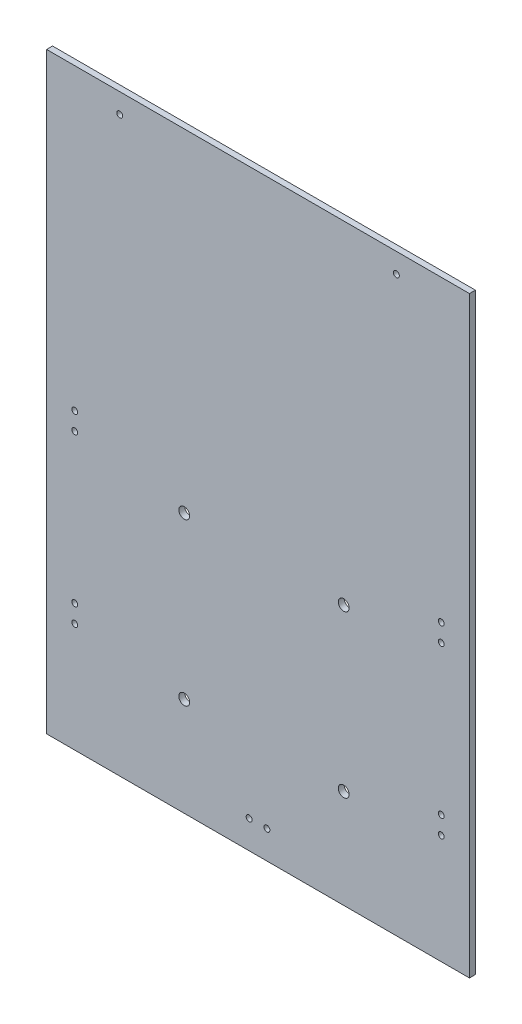
ISO-10303-21;
HEADER;
FILE_DESCRIPTION(('STEP AP214'),'2;1');
FILE_NAME('part.step','',(''),(''),'','','');
FILE_SCHEMA(('AUTOMOTIVE_DESIGN { 1 0 10303 214 1 1 1 1 }'));
ENDSEC;
DATA;
#1=APPLICATION_CONTEXT('core data for automotive mechanical design processes');
#2=APPLICATION_PROTOCOL_DEFINITION('international standard','automotive_design',2000,#1);
#3=PRODUCT_CONTEXT('',#1,'mechanical');
#4=PRODUCT('Part','Part','',(#3));
#5=PRODUCT_RELATED_PRODUCT_CATEGORY('part','',(#4));
#6=PRODUCT_DEFINITION_FORMATION('','',#4);
#7=PRODUCT_DEFINITION_CONTEXT('part definition',#1,'design');
#8=PRODUCT_DEFINITION('design','',#6,#7);
#9=PRODUCT_DEFINITION_SHAPE('','',#8);
#10=(LENGTH_UNIT() NAMED_UNIT(*) SI_UNIT(.MILLI.,.METRE.));
#11=(NAMED_UNIT(*) PLANE_ANGLE_UNIT() SI_UNIT($,.RADIAN.));
#12=(NAMED_UNIT(*) SI_UNIT($,.STERADIAN.) SOLID_ANGLE_UNIT());
#13=UNCERTAINTY_MEASURE_WITH_UNIT(LENGTH_MEASURE(1.E-05),#10,'distance_accuracy_value','');
#14=(GEOMETRIC_REPRESENTATION_CONTEXT(3) GLOBAL_UNCERTAINTY_ASSIGNED_CONTEXT((#13)) GLOBAL_UNIT_ASSIGNED_CONTEXT((#10,
#11,#12)) REPRESENTATION_CONTEXT('',''));
#15=CARTESIAN_POINT('',(0.,0.,0.));
#16=DIRECTION('',(0.,0.,1.));
#17=DIRECTION('',(1.,0.,0.));
#18=AXIS2_PLACEMENT_3D('',#15,#16,#17);
#19=CARTESIAN_POINT('',(0.,0.,3.));
#20=DIRECTION('',(0.,0.,-1.));
#21=DIRECTION('',(-1.,0.,0.));
#22=AXIS2_PLACEMENT_3D('',#19,#20,#21);
#23=PLANE('',#22);
#24=CARTESIAN_POINT('',(-92.7470488231183,-1.25379985810628,3.));
#25=DIRECTION('',(0.,0.,-1.));
#26=DIRECTION('',(-1.,0.,0.));
#27=AXIS2_PLACEMENT_3D('',#24,#25,#26);
#28=CIRCLE('',#27,1.49999999999994);
#29=CARTESIAN_POINT('',(-94.2470488231182,-1.25379985810628,3.));
#30=VERTEX_POINT('',#29);
#31=EDGE_CURVE('E237',#30,#30,#28,.T.);
#32=ORIENTED_EDGE('',*,*,#31,.T.);
#33=EDGE_LOOP('',(#32));
#34=FACE_BOUND('',#33,.T.);
#35=CARTESIAN_POINT('',(-92.7470488231178,-94.6186766336858,3.));
#36=DIRECTION('',(0.,0.,-1.));
#37=DIRECTION('',(-1.,0.,0.));
#38=AXIS2_PLACEMENT_3D('',#35,#36,#37);
#39=CIRCLE('',#38,1.5);
#40=CARTESIAN_POINT('',(-94.2470488231178,-94.6186766336858,3.));
#41=VERTEX_POINT('',#40);
#42=EDGE_CURVE('E241',#41,#41,#39,.T.);
#43=ORIENTED_EDGE('',*,*,#42,.T.);
#44=EDGE_LOOP('',(#43));
#45=FACE_BOUND('',#44,.T.);
#46=CARTESIAN_POINT('',(-92.7470488231183,-85.6186766336858,3.));
#47=DIRECTION('',(0.,0.,-1.));
#48=DIRECTION('',(-1.,0.,0.));
#49=AXIS2_PLACEMENT_3D('',#46,#47,#48);
#50=CIRCLE('',#49,1.50000000000001);
#51=CARTESIAN_POINT('',(-94.2470488231183,-85.6186766336858,3.));
#52=VERTEX_POINT('',#51);
#53=EDGE_CURVE('E245',#52,#52,#50,.T.);
#54=ORIENTED_EDGE('',*,*,#53,.T.);
#55=EDGE_LOOP('',(#54));
#56=FACE_BOUND('',#55,.T.);
#57=CARTESIAN_POINT('',(-92.7470488231153,-10.2537998581044,3.));
#58=DIRECTION('',(0.,0.,-1.));
#59=DIRECTION('',(-1.,0.,0.));
#60=AXIS2_PLACEMENT_3D('',#57,#58,#59);
#61=CIRCLE('',#60,1.50000000000007);
#62=CARTESIAN_POINT('',(-94.2470488231154,-10.2537998581044,3.));
#63=VERTEX_POINT('',#62);
#64=EDGE_CURVE('E233',#63,#63,#61,.T.);
#65=ORIENTED_EDGE('',*,*,#64,.T.);
#66=EDGE_LOOP('',(#65));
#67=FACE_BOUND('',#66,.T.);
#68=DIRECTION('',(1.,0.,0.));
#69=VECTOR('',#68,1.);
#70=CARTESIAN_POINT('',(-102.,-150.,3.));
#71=LINE('',#70,#69);
#72=CARTESIAN_POINT('',(-107.,-150.,3.));
#73=VERTEX_POINT('',#72);
#74=CARTESIAN_POINT('',(107.,-150.,3.));
#75=VERTEX_POINT('',#74);
#76=EDGE_CURVE('E11',#73,#75,#71,.T.);
#77=ORIENTED_EDGE('',*,*,#76,.T.);
#78=DIRECTION('',(0.,-1.,0.));
#79=VECTOR('',#78,1.);
#80=CARTESIAN_POINT('',(107.,150.,3.));
#81=LINE('',#80,#79);
#82=CARTESIAN_POINT('',(107.,150.,3.));
#83=VERTEX_POINT('',#82);
#84=EDGE_CURVE('E104',#83,#75,#81,.T.);
#85=ORIENTED_EDGE('',*,*,#84,.F.);
#86=DIRECTION('',(-1.,0.,0.));
#87=VECTOR('',#86,1.);
#88=CARTESIAN_POINT('',(-102.,150.,3.));
#89=LINE('',#88,#87);
#90=CARTESIAN_POINT('',(-107.,150.,3.));
#91=VERTEX_POINT('',#90);
#92=EDGE_CURVE('E50',#83,#91,#89,.T.);
#93=ORIENTED_EDGE('',*,*,#92,.T.);
#94=DIRECTION('',(0.,1.,0.));
#95=VECTOR('',#94,1.);
#96=CARTESIAN_POINT('',(-107.,-150.,3.));
#97=LINE('',#96,#95);
#98=EDGE_CURVE('E129',#73,#91,#97,.T.);
#99=ORIENTED_EDGE('',*,*,#98,.F.);
#100=EDGE_LOOP('',(#77,#85,#93,#99));
#101=FACE_BOUND('',#100,.T.);
#102=CARTESIAN_POINT('',(-37.3468695251028,-18.3221909613773,3.));
#103=DIRECTION('',(0.,0.,1.));
#104=DIRECTION('',(1.,0.,0.));
#105=AXIS2_PLACEMENT_3D('',#102,#103,#104);
#106=CIRCLE('',#105,2.75);
#107=CARTESIAN_POINT('',(-34.5968695251028,-18.3221909613773,3.));
#108=VERTEX_POINT('',#107);
#109=EDGE_CURVE('E137',#108,#108,#106,.T.);
#110=ORIENTED_EDGE('',*,*,#109,.F.);
#111=EDGE_LOOP('',(#110));
#112=FACE_BOUND('',#111,.T.);
#113=CARTESIAN_POINT('',(43.3468695251028,-18.3221909613773,3.));
#114=DIRECTION('',(0.,0.,1.));
#115=DIRECTION('',(1.,0.,0.));
#116=AXIS2_PLACEMENT_3D('',#113,#114,#115);
#117=CIRCLE('',#116,2.75);
#118=CARTESIAN_POINT('',(46.0968695251028,-18.3221909613773,3.));
#119=VERTEX_POINT('',#118);
#120=EDGE_CURVE('E133',#119,#119,#117,.T.);
#121=ORIENTED_EDGE('',*,*,#120,.F.);
#122=EDGE_LOOP('',(#121));
#123=FACE_BOUND('',#122,.T.);
#124=CARTESIAN_POINT('',(43.3468695251028,-100.,3.));
#125=DIRECTION('',(0.,0.,1.));
#126=DIRECTION('',(1.,0.,0.));
#127=AXIS2_PLACEMENT_3D('',#124,#125,#126);
#128=CIRCLE('',#127,2.75);
#129=CARTESIAN_POINT('',(46.0968695251028,-100.,3.));
#130=VERTEX_POINT('',#129);
#131=EDGE_CURVE('E142',#130,#130,#128,.T.);
#132=ORIENTED_EDGE('',*,*,#131,.F.);
#133=EDGE_LOOP('',(#132));
#134=FACE_BOUND('',#133,.T.);
#135=CARTESIAN_POINT('',(-37.3468695251028,-100.,3.));
#136=DIRECTION('',(0.,0.,1.));
#137=DIRECTION('',(1.,0.,0.));
#138=AXIS2_PLACEMENT_3D('',#135,#136,#137);
#139=CIRCLE('',#138,2.75);
#140=CARTESIAN_POINT('',(-34.5968695251028,-100.,3.));
#141=VERTEX_POINT('',#140);
#142=EDGE_CURVE('E150',#141,#141,#139,.T.);
#143=ORIENTED_EDGE('',*,*,#142,.F.);
#144=EDGE_LOOP('',(#143));
#145=FACE_BOUND('',#144,.T.);
#146=CARTESIAN_POINT('',(92.7470488231198,-94.6186766336858,3.));
#147=DIRECTION('',(0.,0.,1.));
#148=DIRECTION('',(1.,0.,0.));
#149=AXIS2_PLACEMENT_3D('',#146,#147,#148);
#150=CIRCLE('',#149,1.49999999999997);
#151=CARTESIAN_POINT('',(94.2470488231198,-94.6186766336858,3.));
#152=VERTEX_POINT('',#151);
#153=EDGE_CURVE('E113',#152,#152,#150,.T.);
#154=ORIENTED_EDGE('',*,*,#153,.F.);
#155=EDGE_LOOP('',(#154));
#156=FACE_BOUND('',#155,.T.);
#157=CARTESIAN_POINT('',(92.7470488231203,-1.25379985810628,3.));
#158=DIRECTION('',(0.,0.,1.));
#159=DIRECTION('',(1.,0.,0.));
#160=AXIS2_PLACEMENT_3D('',#157,#158,#159);
#161=CIRCLE('',#160,1.49999999999997);
#162=CARTESIAN_POINT('',(94.2470488231203,-1.25379985810628,3.));
#163=VERTEX_POINT('',#162);
#164=EDGE_CURVE('E232',#163,#163,#161,.T.);
#165=ORIENTED_EDGE('',*,*,#164,.F.);
#166=EDGE_LOOP('',(#165));
#167=FACE_BOUND('',#166,.T.);
#168=CARTESIAN_POINT('',(92.7470488231174,-10.2537998581044,3.));
#169=DIRECTION('',(0.,0.,1.));
#170=DIRECTION('',(1.,0.,0.));
#171=AXIS2_PLACEMENT_3D('',#168,#169,#170);
#172=CIRCLE('',#171,1.50000000000008);
#173=CARTESIAN_POINT('',(94.2470488231174,-10.2537998581044,3.));
#174=VERTEX_POINT('',#173);
#175=EDGE_CURVE('E203',#174,#174,#172,.T.);
#176=ORIENTED_EDGE('',*,*,#175,.F.);
#177=EDGE_LOOP('',(#176));
#178=FACE_BOUND('',#177,.T.);
#179=CARTESIAN_POINT('',(92.7470488231203,-85.6186766336858,3.));
#180=DIRECTION('',(0.,0.,1.));
#181=DIRECTION('',(1.,0.,0.));
#182=AXIS2_PLACEMENT_3D('',#179,#180,#181);
#183=CIRCLE('',#182,1.50000000000003);
#184=CARTESIAN_POINT('',(94.2470488231203,-85.6186766336858,3.));
#185=VERTEX_POINT('',#184);
#186=EDGE_CURVE('E249',#185,#185,#183,.T.);
#187=ORIENTED_EDGE('',*,*,#186,.F.);
#188=EDGE_LOOP('',(#187));
#189=FACE_BOUND('',#188,.T.);
#190=CARTESIAN_POINT('',(4.50000000000106,-135.747048823116,3.));
#191=DIRECTION('',(0.,0.,1.));
#192=DIRECTION('',(1.,0.,0.));
#193=AXIS2_PLACEMENT_3D('',#190,#191,#192);
#194=CIRCLE('',#193,1.50000000000009);
#195=CARTESIAN_POINT('',(6.00000000000115,-135.747048823116,3.));
#196=VERTEX_POINT('',#195);
#197=EDGE_CURVE('E213',#196,#196,#194,.T.);
#198=ORIENTED_EDGE('',*,*,#197,.F.);
#199=EDGE_LOOP('',(#198));
#200=FACE_BOUND('',#199,.T.);
#201=CARTESIAN_POINT('',(-4.49999999999895,-135.747048823116,3.));
#202=DIRECTION('',(0.,0.,1.));
#203=DIRECTION('',(1.,0.,0.));
#204=AXIS2_PLACEMENT_3D('',#201,#202,#203);
#205=CIRCLE('',#204,1.50000000000009);
#206=CARTESIAN_POINT('',(-2.99999999999886,-135.747048823116,3.));
#207=VERTEX_POINT('',#206);
#208=EDGE_CURVE('E200',#207,#207,#205,.T.);
#209=ORIENTED_EDGE('',*,*,#208,.F.);
#210=EDGE_LOOP('',(#209));
#211=FACE_BOUND('',#210,.T.);
#212=CARTESIAN_POINT('',(70.,140.,3.));
#213=DIRECTION('',(0.,0.,1.));
#214=DIRECTION('',(1.,0.,0.));
#215=AXIS2_PLACEMENT_3D('',#212,#213,#214);
#216=CIRCLE('',#215,1.5);
#217=CARTESIAN_POINT('',(71.5,140.,3.));
#218=VERTEX_POINT('',#217);
#219=EDGE_CURVE('E215',#218,#218,#216,.F.);
#220=ORIENTED_EDGE('',*,*,#219,.T.);
#221=EDGE_LOOP('',(#220));
#222=FACE_BOUND('',#221,.T.);
#223=CARTESIAN_POINT('',(-70.,140.,3.));
#224=DIRECTION('',(0.,0.,1.));
#225=DIRECTION('',(1.,0.,0.));
#226=AXIS2_PLACEMENT_3D('',#223,#224,#225);
#227=CIRCLE('',#226,1.5);
#228=CARTESIAN_POINT('',(-68.5,140.,3.));
#229=VERTEX_POINT('',#228);
#230=EDGE_CURVE('E207',#229,#229,#227,.T.);
#231=ORIENTED_EDGE('',*,*,#230,.F.);
#232=EDGE_LOOP('',(#231));
#233=FACE_BOUND('',#232,.T.);
#234=ADVANCED_FACE('F40',(#34,#45,#56,#67,#101,#112,#123,#134,#145,#156,#167,#178,#189,#200,
#211,#222,#233),#23,.F.);
#235=CARTESIAN_POINT('',(0.,0.,0.));
#236=DIRECTION('',(0.,0.,-1.));
#237=DIRECTION('',(-1.,0.,0.));
#238=AXIS2_PLACEMENT_3D('',#235,#236,#237);
#239=PLANE('',#238);
#240=CARTESIAN_POINT('',(70.,140.,0.));
#241=DIRECTION('',(0.,0.,-1.));
#242=DIRECTION('',(-1.,0.,0.));
#243=AXIS2_PLACEMENT_3D('',#240,#241,#242);
#244=CIRCLE('',#243,1.5);
#245=CARTESIAN_POINT('',(68.5,140.,0.));
#246=VERTEX_POINT('',#245);
#247=EDGE_CURVE('E204',#246,#246,#244,.F.);
#248=ORIENTED_EDGE('',*,*,#247,.T.);
#249=EDGE_LOOP('',(#248));
#250=FACE_BOUND('',#249,.T.);
#251=CARTESIAN_POINT('',(-4.49999999999895,-135.747048823116,0.));
#252=DIRECTION('',(0.,0.,-1.));
#253=DIRECTION('',(-1.,0.,0.));
#254=AXIS2_PLACEMENT_3D('',#251,#252,#253);
#255=CIRCLE('',#254,1.50000000000009);
#256=CARTESIAN_POINT('',(-5.99999999999904,-135.747048823116,0.));
#257=VERTEX_POINT('',#256);
#258=EDGE_CURVE('E199',#257,#257,#255,.T.);
#259=ORIENTED_EDGE('',*,*,#258,.F.);
#260=EDGE_LOOP('',(#259));
#261=FACE_BOUND('',#260,.T.);
#262=CARTESIAN_POINT('',(4.50000000000106,-135.747048823116,0.));
#263=DIRECTION('',(0.,0.,-1.));
#264=DIRECTION('',(-1.,0.,0.));
#265=AXIS2_PLACEMENT_3D('',#262,#263,#264);
#266=CIRCLE('',#265,1.50000000000009);
#267=CARTESIAN_POINT('',(3.00000000000097,-135.747048823116,0.));
#268=VERTEX_POINT('',#267);
#269=EDGE_CURVE('E195',#268,#268,#266,.T.);
#270=ORIENTED_EDGE('',*,*,#269,.F.);
#271=EDGE_LOOP('',(#270));
#272=FACE_BOUND('',#271,.T.);
#273=CARTESIAN_POINT('',(-92.7470488231178,-94.6186766336858,0.));
#274=DIRECTION('',(0.,0.,-1.));
#275=DIRECTION('',(-1.,0.,0.));
#276=AXIS2_PLACEMENT_3D('',#273,#274,#275);
#277=CIRCLE('',#276,1.5);
#278=CARTESIAN_POINT('',(-94.2470488231178,-94.6186766336858,0.));
#279=VERTEX_POINT('',#278);
#280=EDGE_CURVE('E110',#279,#279,#277,.F.);
#281=ORIENTED_EDGE('',*,*,#280,.T.);
#282=EDGE_LOOP('',(#281));
#283=FACE_BOUND('',#282,.T.);
#284=CARTESIAN_POINT('',(-92.7470488231153,-10.2537998581044,0.));
#285=DIRECTION('',(0.,0.,-1.));
#286=DIRECTION('',(-1.,0.,0.));
#287=AXIS2_PLACEMENT_3D('',#284,#285,#286);
#288=CIRCLE('',#287,1.50000000000007);
#289=CARTESIAN_POINT('',(-94.2470488231154,-10.2537998581044,0.));
#290=VERTEX_POINT('',#289);
#291=EDGE_CURVE('E172',#290,#290,#288,.F.);
#292=ORIENTED_EDGE('',*,*,#291,.T.);
#293=EDGE_LOOP('',(#292));
#294=FACE_BOUND('',#293,.T.);
#295=CARTESIAN_POINT('',(92.7470488231198,-94.6186766336858,0.));
#296=DIRECTION('',(0.,0.,-1.));
#297=DIRECTION('',(-1.,0.,0.));
#298=AXIS2_PLACEMENT_3D('',#295,#296,#297);
#299=CIRCLE('',#298,1.49999999999997);
#300=CARTESIAN_POINT('',(91.2470488231198,-94.6186766336858,0.));
#301=VERTEX_POINT('',#300);
#302=EDGE_CURVE('E168',#301,#301,#299,.T.);
#303=ORIENTED_EDGE('',*,*,#302,.F.);
#304=EDGE_LOOP('',(#303));
#305=FACE_BOUND('',#304,.T.);
#306=CARTESIAN_POINT('',(-37.3468695251028,-100.,0.));
#307=DIRECTION('',(0.,0.,1.));
#308=DIRECTION('',(1.,0.,0.));
#309=AXIS2_PLACEMENT_3D('',#306,#307,#308);
#310=CIRCLE('',#309,2.75);
#311=CARTESIAN_POINT('',(-34.5968695251028,-100.,0.));
#312=VERTEX_POINT('',#311);
#313=EDGE_CURVE('E132',#312,#312,#310,.T.);
#314=ORIENTED_EDGE('',*,*,#313,.T.);
#315=EDGE_LOOP('',(#314));
#316=FACE_BOUND('',#315,.T.);
#317=CARTESIAN_POINT('',(43.3468695251028,-100.,0.));
#318=DIRECTION('',(0.,0.,1.));
#319=DIRECTION('',(1.,0.,0.));
#320=AXIS2_PLACEMENT_3D('',#317,#318,#319);
#321=CIRCLE('',#320,2.75);
#322=CARTESIAN_POINT('',(46.0968695251028,-100.,0.));
#323=VERTEX_POINT('',#322);
#324=EDGE_CURVE('E146',#323,#323,#321,.T.);
#325=ORIENTED_EDGE('',*,*,#324,.T.);
#326=EDGE_LOOP('',(#325));
#327=FACE_BOUND('',#326,.T.);
#328=CARTESIAN_POINT('',(43.3468695251028,-18.3221909613773,0.));
#329=DIRECTION('',(0.,0.,1.));
#330=DIRECTION('',(1.,0.,0.));
#331=AXIS2_PLACEMENT_3D('',#328,#329,#330);
#332=CIRCLE('',#331,2.75);
#333=CARTESIAN_POINT('',(46.0968695251028,-18.3221909613773,0.));
#334=VERTEX_POINT('',#333);
#335=EDGE_CURVE('E138',#334,#334,#332,.T.);
#336=ORIENTED_EDGE('',*,*,#335,.T.);
#337=EDGE_LOOP('',(#336));
#338=FACE_BOUND('',#337,.T.);
#339=CARTESIAN_POINT('',(-37.3468695251028,-18.3221909613773,0.));
#340=DIRECTION('',(0.,0.,1.));
#341=DIRECTION('',(1.,0.,0.));
#342=AXIS2_PLACEMENT_3D('',#339,#340,#341);
#343=CIRCLE('',#342,2.75);
#344=CARTESIAN_POINT('',(-34.5968695251028,-18.3221909613773,0.));
#345=VERTEX_POINT('',#344);
#346=EDGE_CURVE('E157',#345,#345,#343,.T.);
#347=ORIENTED_EDGE('',*,*,#346,.T.);
#348=EDGE_LOOP('',(#347));
#349=FACE_BOUND('',#348,.T.);
#350=DIRECTION('',(-1.,0.,0.));
#351=VECTOR('',#350,1.);
#352=CARTESIAN_POINT('',(-102.,150.,0.));
#353=LINE('',#352,#351);
#354=CARTESIAN_POINT('',(107.,150.,0.));
#355=VERTEX_POINT('',#354);
#356=CARTESIAN_POINT('',(-107.,150.,0.));
#357=VERTEX_POINT('',#356);
#358=EDGE_CURVE('E90',#355,#357,#353,.T.);
#359=ORIENTED_EDGE('',*,*,#358,.F.);
#360=DIRECTION('',(0.,1.,0.));
#361=VECTOR('',#360,1.);
#362=CARTESIAN_POINT('',(107.,-150.,0.));
#363=LINE('',#362,#361);
#364=CARTESIAN_POINT('',(107.,-150.,0.));
#365=VERTEX_POINT('',#364);
#366=EDGE_CURVE('E93',#365,#355,#363,.T.);
#367=ORIENTED_EDGE('',*,*,#366,.F.);
#368=DIRECTION('',(1.,0.,0.));
#369=VECTOR('',#368,1.);
#370=CARTESIAN_POINT('',(-102.,-150.,0.));
#371=LINE('',#370,#369);
#372=CARTESIAN_POINT('',(-107.,-150.,0.));
#373=VERTEX_POINT('',#372);
#374=EDGE_CURVE('E80',#373,#365,#371,.T.);
#375=ORIENTED_EDGE('',*,*,#374,.F.);
#376=DIRECTION('',(0.,-1.,0.));
#377=VECTOR('',#376,1.);
#378=CARTESIAN_POINT('',(-107.,150.,0.));
#379=LINE('',#378,#377);
#380=EDGE_CURVE('E124',#357,#373,#379,.T.);
#381=ORIENTED_EDGE('',*,*,#380,.F.);
#382=EDGE_LOOP('',(#359,#367,#375,#381));
#383=FACE_BOUND('',#382,.T.);
#384=CARTESIAN_POINT('',(92.7470488231203,-1.25379985810628,0.));
#385=DIRECTION('',(0.,0.,-1.));
#386=DIRECTION('',(-1.,0.,0.));
#387=AXIS2_PLACEMENT_3D('',#384,#385,#386);
#388=CIRCLE('',#387,1.49999999999997);
#389=CARTESIAN_POINT('',(91.2470488231203,-1.25379985810628,0.));
#390=VERTEX_POINT('',#389);
#391=EDGE_CURVE('E176',#390,#390,#388,.T.);
#392=ORIENTED_EDGE('',*,*,#391,.F.);
#393=EDGE_LOOP('',(#392));
#394=FACE_BOUND('',#393,.T.);
#395=CARTESIAN_POINT('',(92.7470488231174,-10.2537998581044,0.));
#396=DIRECTION('',(0.,0.,-1.));
#397=DIRECTION('',(-1.,0.,0.));
#398=AXIS2_PLACEMENT_3D('',#395,#396,#397);
#399=CIRCLE('',#398,1.50000000000008);
#400=CARTESIAN_POINT('',(91.2470488231173,-10.2537998581044,0.));
#401=VERTEX_POINT('',#400);
#402=EDGE_CURVE('E180',#401,#401,#399,.T.);
#403=ORIENTED_EDGE('',*,*,#402,.F.);
#404=EDGE_LOOP('',(#403));
#405=FACE_BOUND('',#404,.T.);
#406=CARTESIAN_POINT('',(92.7470488231203,-85.6186766336858,0.));
#407=DIRECTION('',(0.,0.,-1.));
#408=DIRECTION('',(-1.,0.,0.));
#409=AXIS2_PLACEMENT_3D('',#406,#407,#408);
#410=CIRCLE('',#409,1.50000000000003);
#411=CARTESIAN_POINT('',(91.2470488231203,-85.6186766336858,0.));
#412=VERTEX_POINT('',#411);
#413=EDGE_CURVE('E184',#412,#412,#410,.T.);
#414=ORIENTED_EDGE('',*,*,#413,.F.);
#415=EDGE_LOOP('',(#414));
#416=FACE_BOUND('',#415,.T.);
#417=CARTESIAN_POINT('',(-92.7470488231183,-85.6186766336858,0.));
#418=DIRECTION('',(0.,0.,-1.));
#419=DIRECTION('',(-1.,0.,0.));
#420=AXIS2_PLACEMENT_3D('',#417,#418,#419);
#421=CIRCLE('',#420,1.50000000000001);
#422=CARTESIAN_POINT('',(-94.2470488231183,-85.6186766336858,0.));
#423=VERTEX_POINT('',#422);
#424=EDGE_CURVE('E188',#423,#423,#421,.F.);
#425=ORIENTED_EDGE('',*,*,#424,.T.);
#426=EDGE_LOOP('',(#425));
#427=FACE_BOUND('',#426,.T.);
#428=CARTESIAN_POINT('',(-92.7470488231183,-1.25379985810628,0.));
#429=DIRECTION('',(0.,0.,-1.));
#430=DIRECTION('',(-1.,0.,0.));
#431=AXIS2_PLACEMENT_3D('',#428,#429,#430);
#432=CIRCLE('',#431,1.49999999999994);
#433=CARTESIAN_POINT('',(-94.2470488231182,-1.25379985810628,0.));
#434=VERTEX_POINT('',#433);
#435=EDGE_CURVE('E106',#434,#434,#432,.F.);
#436=ORIENTED_EDGE('',*,*,#435,.T.);
#437=EDGE_LOOP('',(#436));
#438=FACE_BOUND('',#437,.T.);
#439=CARTESIAN_POINT('',(-70.,140.,0.));
#440=DIRECTION('',(0.,0.,-1.));
#441=DIRECTION('',(-1.,0.,0.));
#442=AXIS2_PLACEMENT_3D('',#439,#440,#441);
#443=CIRCLE('',#442,1.5);
#444=CARTESIAN_POINT('',(-71.5,140.,0.));
#445=VERTEX_POINT('',#444);
#446=EDGE_CURVE('E44',#445,#445,#443,.T.);
#447=ORIENTED_EDGE('',*,*,#446,.F.);
#448=EDGE_LOOP('',(#447));
#449=FACE_BOUND('',#448,.T.);
#450=ADVANCED_FACE('F94',(#250,#261,#272,#283,#294,#305,#316,#327,#338,#349,#383,#394,#405,#416,
#427,#438,#449),#239,.T.);
#451=CARTESIAN_POINT('',(-102.,150.,3.));
#452=DIRECTION('',(0.,-1.,0.));
#453=DIRECTION('',(0.,0.,-1.));
#454=AXIS2_PLACEMENT_3D('',#451,#452,#453);
#455=PLANE('',#454);
#456=ORIENTED_EDGE('',*,*,#358,.T.);
#457=DIRECTION('',(0.,0.,-1.));
#458=VECTOR('',#457,1.);
#459=CARTESIAN_POINT('',(-107.,150.,3.));
#460=LINE('',#459,#458);
#461=EDGE_CURVE('E120',#91,#357,#460,.T.);
#462=ORIENTED_EDGE('',*,*,#461,.F.);
#463=ORIENTED_EDGE('',*,*,#92,.F.);
#464=DIRECTION('',(0.,0.,1.));
#465=VECTOR('',#464,1.);
#466=CARTESIAN_POINT('',(107.,150.,0.));
#467=LINE('',#466,#465);
#468=EDGE_CURVE('E100',#355,#83,#467,.T.);
#469=ORIENTED_EDGE('',*,*,#468,.F.);
#470=EDGE_LOOP('',(#456,#462,#463,#469));
#471=FACE_BOUND('',#470,.T.);
#472=ADVANCED_FACE('F42',(#471),#455,.F.);
#473=CARTESIAN_POINT('',(-102.,-150.,3.));
#474=DIRECTION('',(0.,1.,0.));
#475=DIRECTION('',(0.,0.,1.));
#476=AXIS2_PLACEMENT_3D('',#473,#474,#475);
#477=PLANE('',#476);
#478=ORIENTED_EDGE('',*,*,#374,.T.);
#479=DIRECTION('',(0.,0.,-1.));
#480=VECTOR('',#479,1.);
#481=CARTESIAN_POINT('',(107.,-150.,3.));
#482=LINE('',#481,#480);
#483=EDGE_CURVE('E84',#75,#365,#482,.T.);
#484=ORIENTED_EDGE('',*,*,#483,.F.);
#485=ORIENTED_EDGE('',*,*,#76,.F.);
#486=DIRECTION('',(0.,0.,1.));
#487=VECTOR('',#486,1.);
#488=CARTESIAN_POINT('',(-107.,-150.,0.));
#489=LINE('',#488,#487);
#490=EDGE_CURVE('E85',#373,#73,#489,.T.);
#491=ORIENTED_EDGE('',*,*,#490,.F.);
#492=EDGE_LOOP('',(#478,#484,#485,#491));
#493=FACE_BOUND('',#492,.T.);
#494=ADVANCED_FACE('F82',(#493),#477,.F.);
#495=CARTESIAN_POINT('',(-37.3468695251028,-18.3221909613773,0.));
#496=DIRECTION('',(0.,0.,1.));
#497=DIRECTION('',(1.,0.,0.));
#498=AXIS2_PLACEMENT_3D('',#495,#496,#497);
#499=CYLINDRICAL_SURFACE('',#498,2.75);
#500=ORIENTED_EDGE('',*,*,#346,.F.);
#501=EDGE_LOOP('',(#500));
#502=FACE_BOUND('',#501,.T.);
#503=ORIENTED_EDGE('',*,*,#109,.T.);
#504=EDGE_LOOP('',(#503));
#505=FACE_BOUND('',#504,.T.);
#506=ADVANCED_FACE('F286',(#502,#505),#499,.F.);
#507=CARTESIAN_POINT('',(43.3468695251028,-18.3221909613773,0.));
#508=DIRECTION('',(0.,0.,1.));
#509=DIRECTION('',(1.,0.,0.));
#510=AXIS2_PLACEMENT_3D('',#507,#508,#509);
#511=CYLINDRICAL_SURFACE('',#510,2.75);
#512=ORIENTED_EDGE('',*,*,#335,.F.);
#513=EDGE_LOOP('',(#512));
#514=FACE_BOUND('',#513,.T.);
#515=ORIENTED_EDGE('',*,*,#120,.T.);
#516=EDGE_LOOP('',(#515));
#517=FACE_BOUND('',#516,.T.);
#518=ADVANCED_FACE('F294',(#514,#517),#511,.F.);
#519=CARTESIAN_POINT('',(43.3468695251028,-100.,0.));
#520=DIRECTION('',(0.,0.,1.));
#521=DIRECTION('',(1.,0.,0.));
#522=AXIS2_PLACEMENT_3D('',#519,#520,#521);
#523=CYLINDRICAL_SURFACE('',#522,2.75);
#524=ORIENTED_EDGE('',*,*,#324,.F.);
#525=EDGE_LOOP('',(#524));
#526=FACE_BOUND('',#525,.T.);
#527=ORIENTED_EDGE('',*,*,#131,.T.);
#528=EDGE_LOOP('',(#527));
#529=FACE_BOUND('',#528,.T.);
#530=ADVANCED_FACE('F488',(#526,#529),#523,.F.);
#531=CARTESIAN_POINT('',(-37.3468695251028,-100.,0.));
#532=DIRECTION('',(0.,0.,1.));
#533=DIRECTION('',(1.,0.,0.));
#534=AXIS2_PLACEMENT_3D('',#531,#532,#533);
#535=CYLINDRICAL_SURFACE('',#534,2.75);
#536=ORIENTED_EDGE('',*,*,#313,.F.);
#537=EDGE_LOOP('',(#536));
#538=FACE_BOUND('',#537,.T.);
#539=ORIENTED_EDGE('',*,*,#142,.T.);
#540=EDGE_LOOP('',(#539));
#541=FACE_BOUND('',#540,.T.);
#542=ADVANCED_FACE('F481',(#538,#541),#535,.F.);
#543=CARTESIAN_POINT('',(-107.,0.,0.));
#544=DIRECTION('',(-1.,0.,0.));
#545=DIRECTION('',(0.,0.,1.));
#546=AXIS2_PLACEMENT_3D('',#543,#544,#545);
#547=PLANE('',#546);
#548=ORIENTED_EDGE('',*,*,#461,.T.);
#549=ORIENTED_EDGE('',*,*,#380,.T.);
#550=ORIENTED_EDGE('',*,*,#490,.T.);
#551=ORIENTED_EDGE('',*,*,#98,.T.);
#552=EDGE_LOOP('',(#548,#549,#550,#551));
#553=FACE_BOUND('',#552,.T.);
#554=ADVANCED_FACE('F302',(#553),#547,.T.);
#555=CARTESIAN_POINT('',(107.,0.,0.));
#556=DIRECTION('',(1.,0.,0.));
#557=DIRECTION('',(0.,0.,-1.));
#558=AXIS2_PLACEMENT_3D('',#555,#556,#557);
#559=PLANE('',#558);
#560=ORIENTED_EDGE('',*,*,#483,.T.);
#561=ORIENTED_EDGE('',*,*,#366,.T.);
#562=ORIENTED_EDGE('',*,*,#468,.T.);
#563=ORIENTED_EDGE('',*,*,#84,.T.);
#564=EDGE_LOOP('',(#560,#561,#562,#563));
#565=FACE_BOUND('',#564,.T.);
#566=ADVANCED_FACE('F103',(#565),#559,.T.);
#567=CARTESIAN_POINT('',(92.7470488231198,-94.6186766336858,-7.));
#568=DIRECTION('',(0.,0.,1.));
#569=DIRECTION('',(1.,0.,0.));
#570=AXIS2_PLACEMENT_3D('',#567,#568,#569);
#571=CYLINDRICAL_SURFACE('',#570,1.49999999999997);
#572=ORIENTED_EDGE('',*,*,#302,.T.);
#573=EDGE_LOOP('',(#572));
#574=FACE_BOUND('',#573,.T.);
#575=ORIENTED_EDGE('',*,*,#153,.T.);
#576=EDGE_LOOP('',(#575));
#577=FACE_BOUND('',#576,.T.);
#578=ADVANCED_FACE('F355',(#574,#577),#571,.F.);
#579=CARTESIAN_POINT('',(-92.7470488231153,-10.2537998581044,-7.));
#580=DIRECTION('',(0.,0.,1.));
#581=DIRECTION('',(1.,0.,0.));
#582=AXIS2_PLACEMENT_3D('',#579,#580,#581);
#583=CYLINDRICAL_SURFACE('',#582,1.50000000000007);
#584=ORIENTED_EDGE('',*,*,#291,.F.);
#585=EDGE_LOOP('',(#584));
#586=FACE_BOUND('',#585,.T.);
#587=ORIENTED_EDGE('',*,*,#64,.F.);
#588=EDGE_LOOP('',(#587));
#589=FACE_BOUND('',#588,.T.);
#590=ADVANCED_FACE('F352',(#586,#589),#583,.F.);
#591=CARTESIAN_POINT('',(92.7470488231203,-1.25379985810628,-7.));
#592=DIRECTION('',(0.,0.,1.));
#593=DIRECTION('',(1.,0.,0.));
#594=AXIS2_PLACEMENT_3D('',#591,#592,#593);
#595=CYLINDRICAL_SURFACE('',#594,1.49999999999997);
#596=ORIENTED_EDGE('',*,*,#391,.T.);
#597=EDGE_LOOP('',(#596));
#598=FACE_BOUND('',#597,.T.);
#599=ORIENTED_EDGE('',*,*,#164,.T.);
#600=EDGE_LOOP('',(#599));
#601=FACE_BOUND('',#600,.T.);
#602=ADVANCED_FACE('F350',(#598,#601),#595,.F.);
#603=CARTESIAN_POINT('',(92.7470488231174,-10.2537998581044,-7.));
#604=DIRECTION('',(0.,0.,1.));
#605=DIRECTION('',(1.,0.,0.));
#606=AXIS2_PLACEMENT_3D('',#603,#604,#605);
#607=CYLINDRICAL_SURFACE('',#606,1.50000000000008);
#608=ORIENTED_EDGE('',*,*,#402,.T.);
#609=EDGE_LOOP('',(#608));
#610=FACE_BOUND('',#609,.T.);
#611=ORIENTED_EDGE('',*,*,#175,.T.);
#612=EDGE_LOOP('',(#611));
#613=FACE_BOUND('',#612,.T.);
#614=ADVANCED_FACE('F271',(#610,#613),#607,.F.);
#615=CARTESIAN_POINT('',(92.7470488231203,-85.6186766336858,-7.));
#616=DIRECTION('',(0.,0.,1.));
#617=DIRECTION('',(1.,0.,0.));
#618=AXIS2_PLACEMENT_3D('',#615,#616,#617);
#619=CYLINDRICAL_SURFACE('',#618,1.50000000000003);
#620=ORIENTED_EDGE('',*,*,#413,.T.);
#621=EDGE_LOOP('',(#620));
#622=FACE_BOUND('',#621,.T.);
#623=ORIENTED_EDGE('',*,*,#186,.T.);
#624=EDGE_LOOP('',(#623));
#625=FACE_BOUND('',#624,.T.);
#626=ADVANCED_FACE('F261',(#622,#625),#619,.F.);
#627=CARTESIAN_POINT('',(-92.7470488231183,-85.6186766336858,-7.));
#628=DIRECTION('',(0.,0.,1.));
#629=DIRECTION('',(1.,0.,0.));
#630=AXIS2_PLACEMENT_3D('',#627,#628,#629);
#631=CYLINDRICAL_SURFACE('',#630,1.50000000000001);
#632=ORIENTED_EDGE('',*,*,#424,.F.);
#633=EDGE_LOOP('',(#632));
#634=FACE_BOUND('',#633,.T.);
#635=ORIENTED_EDGE('',*,*,#53,.F.);
#636=EDGE_LOOP('',(#635));
#637=FACE_BOUND('',#636,.T.);
#638=ADVANCED_FACE('F258',(#634,#637),#631,.F.);
#639=CARTESIAN_POINT('',(-92.7470488231178,-94.6186766336858,-7.));
#640=DIRECTION('',(0.,0.,1.));
#641=DIRECTION('',(1.,0.,0.));
#642=AXIS2_PLACEMENT_3D('',#639,#640,#641);
#643=CYLINDRICAL_SURFACE('',#642,1.5);
#644=ORIENTED_EDGE('',*,*,#280,.F.);
#645=EDGE_LOOP('',(#644));
#646=FACE_BOUND('',#645,.T.);
#647=ORIENTED_EDGE('',*,*,#42,.F.);
#648=EDGE_LOOP('',(#647));
#649=FACE_BOUND('',#648,.T.);
#650=ADVANCED_FACE('F260',(#646,#649),#643,.F.);
#651=CARTESIAN_POINT('',(-92.7470488231183,-1.25379985810628,-7.));
#652=DIRECTION('',(0.,0.,1.));
#653=DIRECTION('',(1.,0.,0.));
#654=AXIS2_PLACEMENT_3D('',#651,#652,#653);
#655=CYLINDRICAL_SURFACE('',#654,1.49999999999994);
#656=ORIENTED_EDGE('',*,*,#435,.F.);
#657=EDGE_LOOP('',(#656));
#658=FACE_BOUND('',#657,.T.);
#659=ORIENTED_EDGE('',*,*,#31,.F.);
#660=EDGE_LOOP('',(#659));
#661=FACE_BOUND('',#660,.T.);
#662=ADVANCED_FACE('F268',(#658,#661),#655,.F.);
#663=CARTESIAN_POINT('',(4.50000000000106,-135.747048823116,-7.));
#664=DIRECTION('',(0.,0.,1.));
#665=DIRECTION('',(1.,0.,0.));
#666=AXIS2_PLACEMENT_3D('',#663,#664,#665);
#667=CYLINDRICAL_SURFACE('',#666,1.50000000000009);
#668=ORIENTED_EDGE('',*,*,#269,.T.);
#669=EDGE_LOOP('',(#668));
#670=FACE_BOUND('',#669,.T.);
#671=ORIENTED_EDGE('',*,*,#197,.T.);
#672=EDGE_LOOP('',(#671));
#673=FACE_BOUND('',#672,.T.);
#674=ADVANCED_FACE('F341',(#670,#673),#667,.F.);
#675=CARTESIAN_POINT('',(-4.49999999999895,-135.747048823116,-7.));
#676=DIRECTION('',(0.,0.,1.));
#677=DIRECTION('',(1.,0.,0.));
#678=AXIS2_PLACEMENT_3D('',#675,#676,#677);
#679=CYLINDRICAL_SURFACE('',#678,1.50000000000009);
#680=ORIENTED_EDGE('',*,*,#258,.T.);
#681=EDGE_LOOP('',(#680));
#682=FACE_BOUND('',#681,.T.);
#683=ORIENTED_EDGE('',*,*,#208,.T.);
#684=EDGE_LOOP('',(#683));
#685=FACE_BOUND('',#684,.T.);
#686=ADVANCED_FACE('F331',(#682,#685),#679,.F.);
#687=CARTESIAN_POINT('',(70.,140.,-7.));
#688=DIRECTION('',(0.,0.,1.));
#689=DIRECTION('',(1.,0.,0.));
#690=AXIS2_PLACEMENT_3D('',#687,#688,#689);
#691=CYLINDRICAL_SURFACE('',#690,1.5);
#692=ORIENTED_EDGE('',*,*,#247,.F.);
#693=EDGE_LOOP('',(#692));
#694=FACE_BOUND('',#693,.T.);
#695=ORIENTED_EDGE('',*,*,#219,.F.);
#696=EDGE_LOOP('',(#695));
#697=FACE_BOUND('',#696,.T.);
#698=ADVANCED_FACE('F328',(#694,#697),#691,.F.);
#699=CARTESIAN_POINT('',(-70.,140.,-7.));
#700=DIRECTION('',(0.,0.,1.));
#701=DIRECTION('',(1.,0.,0.));
#702=AXIS2_PLACEMENT_3D('',#699,#700,#701);
#703=CYLINDRICAL_SURFACE('',#702,1.5);
#704=ORIENTED_EDGE('',*,*,#446,.T.);
#705=EDGE_LOOP('',(#704));
#706=FACE_BOUND('',#705,.T.);
#707=ORIENTED_EDGE('',*,*,#230,.T.);
#708=EDGE_LOOP('',(#707));
#709=FACE_BOUND('',#708,.T.);
#710=ADVANCED_FACE('F330',(#706,#709),#703,.F.);
#711=CLOSED_SHELL('',(#234,#450,#472,#494,#506,#518,#530,#542,#554,#566,#578,#590,#602,#614,
#626,#638,#650,#662,#674,#686,#698,#710));
#712=MANIFOLD_SOLID_BREP('B2',#711);
#713=ADVANCED_BREP_SHAPE_REPRESENTATION('',(#18,#712),#14);
#714=SHAPE_DEFINITION_REPRESENTATION(#9,#713);
ENDSEC;
END-ISO-10303-21;
